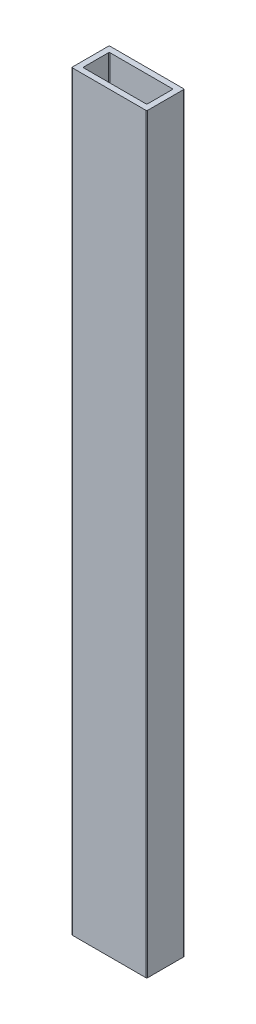
ISO-10303-21;
HEADER;
FILE_DESCRIPTION(('STEP AP214'),'2;1');
FILE_NAME('part.step','',(''),(''),'','','');
FILE_SCHEMA(('AUTOMOTIVE_DESIGN { 1 0 10303 214 1 1 1 1 }'));
ENDSEC;
DATA;
#1=APPLICATION_CONTEXT('core data for automotive mechanical design processes');
#2=APPLICATION_PROTOCOL_DEFINITION('international standard','automotive_design',2000,#1);
#3=PRODUCT_CONTEXT('',#1,'mechanical');
#4=PRODUCT('Part','Part','',(#3));
#5=PRODUCT_RELATED_PRODUCT_CATEGORY('part','',(#4));
#6=PRODUCT_DEFINITION_FORMATION('','',#4);
#7=PRODUCT_DEFINITION_CONTEXT('part definition',#1,'design');
#8=PRODUCT_DEFINITION('design','',#6,#7);
#9=PRODUCT_DEFINITION_SHAPE('','',#8);
#10=(LENGTH_UNIT() NAMED_UNIT(*) SI_UNIT(.MILLI.,.METRE.));
#11=(NAMED_UNIT(*) PLANE_ANGLE_UNIT() SI_UNIT($,.RADIAN.));
#12=(NAMED_UNIT(*) SI_UNIT($,.STERADIAN.) SOLID_ANGLE_UNIT());
#13=UNCERTAINTY_MEASURE_WITH_UNIT(LENGTH_MEASURE(1.E-05),#10,'distance_accuracy_value','');
#14=(GEOMETRIC_REPRESENTATION_CONTEXT(3) GLOBAL_UNCERTAINTY_ASSIGNED_CONTEXT((#13)) GLOBAL_UNIT_ASSIGNED_CONTEXT((#10,
#11,#12)) REPRESENTATION_CONTEXT('',''));
#15=CARTESIAN_POINT('',(0.,0.,0.));
#16=DIRECTION('',(0.,0.,1.));
#17=DIRECTION('',(1.,0.,0.));
#18=AXIS2_PLACEMENT_3D('',#15,#16,#17);
#19=CARTESIAN_POINT('',(0.,200.,0.));
#20=DIRECTION('',(0.,-1.,0.));
#21=DIRECTION('',(0.,0.,-1.));
#22=AXIS2_PLACEMENT_3D('',#19,#20,#21);
#23=PLANE('',#22);
#24=DIRECTION('',(0.,0.,-1.));
#25=VECTOR('',#24,1.);
#26=CARTESIAN_POINT('',(10.,200.,-5.));
#27=LINE('',#26,#25);
#28=CARTESIAN_POINT('',(10.,200.,4.8));
#29=VERTEX_POINT('',#28);
#30=CARTESIAN_POINT('',(10.,200.,-4.8));
#31=VERTEX_POINT('',#30);
#32=EDGE_CURVE('E278',#29,#31,#27,.T.);
#33=ORIENTED_EDGE('',*,*,#32,.T.);
#34=CARTESIAN_POINT('',(9.8,200.,-4.8));
#35=DIRECTION('',(0.,-1.,0.));
#36=DIRECTION('',(0.,0.,-1.));
#37=AXIS2_PLACEMENT_3D('',#34,#35,#36);
#38=CIRCLE('',#37,0.2);
#39=CARTESIAN_POINT('',(9.8,200.,-5.));
#40=VERTEX_POINT('',#39);
#41=EDGE_CURVE('E199',#31,#40,#38,.F.);
#42=ORIENTED_EDGE('',*,*,#41,.T.);
#43=DIRECTION('',(-1.,0.,0.));
#44=VECTOR('',#43,1.);
#45=CARTESIAN_POINT('',(10.,200.,-5.));
#46=LINE('',#45,#44);
#47=CARTESIAN_POINT('',(-9.8,200.,-5.));
#48=VERTEX_POINT('',#47);
#49=EDGE_CURVE('E168',#40,#48,#46,.T.);
#50=ORIENTED_EDGE('',*,*,#49,.T.);
#51=CARTESIAN_POINT('',(-9.8,200.,-4.8));
#52=DIRECTION('',(0.,-1.,0.));
#53=DIRECTION('',(0.,0.,-1.));
#54=AXIS2_PLACEMENT_3D('',#51,#52,#53);
#55=CIRCLE('',#54,0.2);
#56=CARTESIAN_POINT('',(-10.,200.,-4.8));
#57=VERTEX_POINT('',#56);
#58=EDGE_CURVE('E197',#48,#57,#55,.F.);
#59=ORIENTED_EDGE('',*,*,#58,.T.);
#60=DIRECTION('',(0.,0.,1.));
#61=VECTOR('',#60,1.);
#62=CARTESIAN_POINT('',(-10.,200.,-5.));
#63=LINE('',#62,#61);
#64=CARTESIAN_POINT('',(-10.,200.,4.8));
#65=VERTEX_POINT('',#64);
#66=EDGE_CURVE('E175',#57,#65,#63,.T.);
#67=ORIENTED_EDGE('',*,*,#66,.T.);
#68=CARTESIAN_POINT('',(-9.8,200.,4.8));
#69=DIRECTION('',(0.,-1.,0.));
#70=DIRECTION('',(0.,0.,-1.));
#71=AXIS2_PLACEMENT_3D('',#68,#69,#70);
#72=CIRCLE('',#71,0.2);
#73=CARTESIAN_POINT('',(-9.8,200.,5.));
#74=VERTEX_POINT('',#73);
#75=EDGE_CURVE('E193',#65,#74,#72,.F.);
#76=ORIENTED_EDGE('',*,*,#75,.T.);
#77=DIRECTION('',(1.,0.,0.));
#78=VECTOR('',#77,1.);
#79=CARTESIAN_POINT('',(10.,200.,5.));
#80=LINE('',#79,#78);
#81=CARTESIAN_POINT('',(9.8,200.,5.));
#82=VERTEX_POINT('',#81);
#83=EDGE_CURVE('E179',#74,#82,#80,.T.);
#84=ORIENTED_EDGE('',*,*,#83,.T.);
#85=CARTESIAN_POINT('',(9.8,200.,4.8));
#86=DIRECTION('',(0.,-1.,0.));
#87=DIRECTION('',(0.,0.,-1.));
#88=AXIS2_PLACEMENT_3D('',#85,#86,#87);
#89=CIRCLE('',#88,0.2);
#90=EDGE_CURVE('E195',#82,#29,#89,.F.);
#91=ORIENTED_EDGE('',*,*,#90,.T.);
#92=EDGE_LOOP('',(#33,#42,#50,#59,#67,#76,#84,#91));
#93=FACE_BOUND('',#92,.T.);
#94=DIRECTION('',(0.,0.,-1.));
#95=VECTOR('',#94,1.);
#96=CARTESIAN_POINT('',(8.5,200.,-3.5));
#97=LINE('',#96,#95);
#98=CARTESIAN_POINT('',(8.5,200.,3.3));
#99=VERTEX_POINT('',#98);
#100=CARTESIAN_POINT('',(8.5,200.,-3.3));
#101=VERTEX_POINT('',#100);
#102=EDGE_CURVE('E260',#99,#101,#97,.T.);
#103=ORIENTED_EDGE('',*,*,#102,.F.);
#104=CARTESIAN_POINT('',(8.3,200.,3.3));
#105=DIRECTION('',(0.,-1.,0.));
#106=DIRECTION('',(0.,0.,-1.));
#107=AXIS2_PLACEMENT_3D('',#104,#105,#106);
#108=CIRCLE('',#107,0.2);
#109=CARTESIAN_POINT('',(8.3,200.,3.5));
#110=VERTEX_POINT('',#109);
#111=EDGE_CURVE('E236',#99,#110,#108,.T.);
#112=ORIENTED_EDGE('',*,*,#111,.T.);
#113=DIRECTION('',(1.,0.,0.));
#114=VECTOR('',#113,1.);
#115=CARTESIAN_POINT('',(8.5,200.,3.5));
#116=LINE('',#115,#114);
#117=CARTESIAN_POINT('',(-8.3,200.,3.5));
#118=VERTEX_POINT('',#117);
#119=EDGE_CURVE('E262',#118,#110,#116,.T.);
#120=ORIENTED_EDGE('',*,*,#119,.F.);
#121=CARTESIAN_POINT('',(-8.3,200.,3.3));
#122=DIRECTION('',(0.,-1.,0.));
#123=DIRECTION('',(0.,0.,-1.));
#124=AXIS2_PLACEMENT_3D('',#121,#122,#123);
#125=CIRCLE('',#124,0.2);
#126=CARTESIAN_POINT('',(-8.5,200.,3.3));
#127=VERTEX_POINT('',#126);
#128=EDGE_CURVE('E240',#118,#127,#125,.T.);
#129=ORIENTED_EDGE('',*,*,#128,.T.);
#130=DIRECTION('',(0.,0.,1.));
#131=VECTOR('',#130,1.);
#132=CARTESIAN_POINT('',(-8.5,200.,-3.5));
#133=LINE('',#132,#131);
#134=CARTESIAN_POINT('',(-8.5,200.,-3.3));
#135=VERTEX_POINT('',#134);
#136=EDGE_CURVE('E259',#135,#127,#133,.T.);
#137=ORIENTED_EDGE('',*,*,#136,.F.);
#138=CARTESIAN_POINT('',(-8.3,200.,-3.3));
#139=DIRECTION('',(0.,-1.,0.));
#140=DIRECTION('',(0.,0.,-1.));
#141=AXIS2_PLACEMENT_3D('',#138,#139,#140);
#142=CIRCLE('',#141,0.2);
#143=CARTESIAN_POINT('',(-8.3,200.,-3.5));
#144=VERTEX_POINT('',#143);
#145=EDGE_CURVE('E11',#135,#144,#142,.T.);
#146=ORIENTED_EDGE('',*,*,#145,.T.);
#147=DIRECTION('',(-1.,0.,0.));
#148=VECTOR('',#147,1.);
#149=CARTESIAN_POINT('',(8.5,200.,-3.5));
#150=LINE('',#149,#148);
#151=CARTESIAN_POINT('',(8.3,200.,-3.5));
#152=VERTEX_POINT('',#151);
#153=EDGE_CURVE('E257',#152,#144,#150,.T.);
#154=ORIENTED_EDGE('',*,*,#153,.F.);
#155=CARTESIAN_POINT('',(8.3,200.,-3.3));
#156=DIRECTION('',(0.,-1.,0.));
#157=DIRECTION('',(0.,0.,-1.));
#158=AXIS2_PLACEMENT_3D('',#155,#156,#157);
#159=CIRCLE('',#158,0.2);
#160=EDGE_CURVE('E232',#152,#101,#159,.T.);
#161=ORIENTED_EDGE('',*,*,#160,.T.);
#162=EDGE_LOOP('',(#103,#112,#120,#129,#137,#146,#154,#161));
#163=FACE_BOUND('',#162,.T.);
#164=ADVANCED_FACE('F35',(#93,#163),#23,.F.);
#165=CARTESIAN_POINT('',(0.,0.,0.));
#166=DIRECTION('',(0.,-1.,0.));
#167=DIRECTION('',(0.,0.,-1.));
#168=AXIS2_PLACEMENT_3D('',#165,#166,#167);
#169=PLANE('',#168);
#170=DIRECTION('',(-1.,0.,0.));
#171=VECTOR('',#170,1.);
#172=CARTESIAN_POINT('',(10.,0.,-5.));
#173=LINE('',#172,#171);
#174=CARTESIAN_POINT('',(9.8,0.,-5.));
#175=VERTEX_POINT('',#174);
#176=CARTESIAN_POINT('',(-9.8,0.,-5.));
#177=VERTEX_POINT('',#176);
#178=EDGE_CURVE('E165',#175,#177,#173,.T.);
#179=ORIENTED_EDGE('',*,*,#178,.F.);
#180=CARTESIAN_POINT('',(9.8,0.,-4.8));
#181=DIRECTION('',(0.,-1.,0.));
#182=DIRECTION('',(0.,0.,-1.));
#183=AXIS2_PLACEMENT_3D('',#180,#181,#182);
#184=CIRCLE('',#183,0.2);
#185=CARTESIAN_POINT('',(10.,0.,-4.8));
#186=VERTEX_POINT('',#185);
#187=EDGE_CURVE('E148',#175,#186,#184,.T.);
#188=ORIENTED_EDGE('',*,*,#187,.T.);
#189=DIRECTION('',(0.,0.,-1.));
#190=VECTOR('',#189,1.);
#191=CARTESIAN_POINT('',(10.,0.,-5.));
#192=LINE('',#191,#190);
#193=CARTESIAN_POINT('',(10.,0.,4.8));
#194=VERTEX_POINT('',#193);
#195=EDGE_CURVE('E176',#194,#186,#192,.T.);
#196=ORIENTED_EDGE('',*,*,#195,.F.);
#197=CARTESIAN_POINT('',(9.8,0.,4.8));
#198=DIRECTION('',(0.,-1.,0.));
#199=DIRECTION('',(0.,0.,-1.));
#200=AXIS2_PLACEMENT_3D('',#197,#198,#199);
#201=CIRCLE('',#200,0.2);
#202=CARTESIAN_POINT('',(9.8,0.,5.));
#203=VERTEX_POINT('',#202);
#204=EDGE_CURVE('E187',#194,#203,#201,.T.);
#205=ORIENTED_EDGE('',*,*,#204,.T.);
#206=DIRECTION('',(1.,0.,0.));
#207=VECTOR('',#206,1.);
#208=CARTESIAN_POINT('',(10.,0.,5.));
#209=LINE('',#208,#207);
#210=CARTESIAN_POINT('',(-9.8,0.,5.));
#211=VERTEX_POINT('',#210);
#212=EDGE_CURVE('E181',#211,#203,#209,.T.);
#213=ORIENTED_EDGE('',*,*,#212,.F.);
#214=CARTESIAN_POINT('',(-9.8,0.,4.8));
#215=DIRECTION('',(0.,-1.,0.));
#216=DIRECTION('',(0.,0.,-1.));
#217=AXIS2_PLACEMENT_3D('',#214,#215,#216);
#218=CIRCLE('',#217,0.2);
#219=CARTESIAN_POINT('',(-10.,0.,4.8));
#220=VERTEX_POINT('',#219);
#221=EDGE_CURVE('E169',#211,#220,#218,.T.);
#222=ORIENTED_EDGE('',*,*,#221,.T.);
#223=DIRECTION('',(0.,0.,1.));
#224=VECTOR('',#223,1.);
#225=CARTESIAN_POINT('',(-10.,0.,-5.));
#226=LINE('',#225,#224);
#227=CARTESIAN_POINT('',(-10.,0.,-4.8));
#228=VERTEX_POINT('',#227);
#229=EDGE_CURVE('E269',#228,#220,#226,.T.);
#230=ORIENTED_EDGE('',*,*,#229,.F.);
#231=CARTESIAN_POINT('',(-9.8,0.,-4.8));
#232=DIRECTION('',(0.,-1.,0.));
#233=DIRECTION('',(0.,0.,-1.));
#234=AXIS2_PLACEMENT_3D('',#231,#232,#233);
#235=CIRCLE('',#234,0.2);
#236=EDGE_CURVE('E159',#228,#177,#235,.T.);
#237=ORIENTED_EDGE('',*,*,#236,.T.);
#238=EDGE_LOOP('',(#179,#188,#196,#205,#213,#222,#230,#237));
#239=FACE_BOUND('',#238,.T.);
#240=DIRECTION('',(0.,0.,1.));
#241=VECTOR('',#240,1.);
#242=CARTESIAN_POINT('',(-8.5,0.,-3.5));
#243=LINE('',#242,#241);
#244=CARTESIAN_POINT('',(-8.5,0.,-3.3));
#245=VERTEX_POINT('',#244);
#246=CARTESIAN_POINT('',(-8.5,0.,3.3));
#247=VERTEX_POINT('',#246);
#248=EDGE_CURVE('E244',#245,#247,#243,.T.);
#249=ORIENTED_EDGE('',*,*,#248,.T.);
#250=CARTESIAN_POINT('',(-8.3,0.,3.3));
#251=DIRECTION('',(0.,-1.,0.));
#252=DIRECTION('',(0.,0.,-1.));
#253=AXIS2_PLACEMENT_3D('',#250,#251,#252);
#254=CIRCLE('',#253,0.2);
#255=CARTESIAN_POINT('',(-8.3,0.,3.5));
#256=VERTEX_POINT('',#255);
#257=EDGE_CURVE('E238',#247,#256,#254,.F.);
#258=ORIENTED_EDGE('',*,*,#257,.T.);
#259=DIRECTION('',(1.,0.,0.));
#260=VECTOR('',#259,1.);
#261=CARTESIAN_POINT('',(8.5,0.,3.5));
#262=LINE('',#261,#260);
#263=CARTESIAN_POINT('',(8.3,0.,3.5));
#264=VERTEX_POINT('',#263);
#265=EDGE_CURVE('E253',#256,#264,#262,.T.);
#266=ORIENTED_EDGE('',*,*,#265,.T.);
#267=CARTESIAN_POINT('',(8.3,0.,3.3));
#268=DIRECTION('',(0.,-1.,0.));
#269=DIRECTION('',(0.,0.,-1.));
#270=AXIS2_PLACEMENT_3D('',#267,#268,#269);
#271=CIRCLE('',#270,0.2);
#272=CARTESIAN_POINT('',(8.5,0.,3.3));
#273=VERTEX_POINT('',#272);
#274=EDGE_CURVE('E234',#264,#273,#271,.F.);
#275=ORIENTED_EDGE('',*,*,#274,.T.);
#276=DIRECTION('',(0.,0.,-1.));
#277=VECTOR('',#276,1.);
#278=CARTESIAN_POINT('',(8.5,0.,-3.5));
#279=LINE('',#278,#277);
#280=CARTESIAN_POINT('',(8.5,0.,-3.3));
#281=VERTEX_POINT('',#280);
#282=EDGE_CURVE('E270',#273,#281,#279,.T.);
#283=ORIENTED_EDGE('',*,*,#282,.T.);
#284=CARTESIAN_POINT('',(8.3,0.,-3.3));
#285=DIRECTION('',(0.,-1.,0.));
#286=DIRECTION('',(0.,0.,-1.));
#287=AXIS2_PLACEMENT_3D('',#284,#285,#286);
#288=CIRCLE('',#287,0.2);
#289=CARTESIAN_POINT('',(8.3,0.,-3.5));
#290=VERTEX_POINT('',#289);
#291=EDGE_CURVE('E230',#281,#290,#288,.F.);
#292=ORIENTED_EDGE('',*,*,#291,.T.);
#293=DIRECTION('',(-1.,0.,0.));
#294=VECTOR('',#293,1.);
#295=CARTESIAN_POINT('',(8.5,0.,-3.5));
#296=LINE('',#295,#294);
#297=CARTESIAN_POINT('',(-8.3,0.,-3.5));
#298=VERTEX_POINT('',#297);
#299=EDGE_CURVE('E245',#290,#298,#296,.T.);
#300=ORIENTED_EDGE('',*,*,#299,.T.);
#301=CARTESIAN_POINT('',(-8.3,0.,-3.3));
#302=DIRECTION('',(0.,-1.,0.));
#303=DIRECTION('',(0.,0.,-1.));
#304=AXIS2_PLACEMENT_3D('',#301,#302,#303);
#305=CIRCLE('',#304,0.2);
#306=EDGE_CURVE('E43',#298,#245,#305,.F.);
#307=ORIENTED_EDGE('',*,*,#306,.T.);
#308=EDGE_LOOP('',(#249,#258,#266,#275,#283,#292,#300,#307));
#309=FACE_BOUND('',#308,.T.);
#310=ADVANCED_FACE('F172',(#239,#309),#169,.T.);
#311=CARTESIAN_POINT('',(-10.,200.,-5.));
#312=DIRECTION('',(1.,0.,0.));
#313=DIRECTION('',(0.,0.,-1.));
#314=AXIS2_PLACEMENT_3D('',#311,#312,#313);
#315=PLANE('',#314);
#316=ORIENTED_EDGE('',*,*,#66,.F.);
#317=DIRECTION('',(0.,-1.,0.));
#318=VECTOR('',#317,1.);
#319=CARTESIAN_POINT('',(-10.,200.,-4.8));
#320=LINE('',#319,#318);
#321=EDGE_CURVE('E222',#57,#228,#320,.T.);
#322=ORIENTED_EDGE('',*,*,#321,.T.);
#323=ORIENTED_EDGE('',*,*,#229,.T.);
#324=DIRECTION('',(0.,-1.,0.));
#325=VECTOR('',#324,1.);
#326=CARTESIAN_POINT('',(-10.,200.,4.8));
#327=LINE('',#326,#325);
#328=EDGE_CURVE('E220',#220,#65,#327,.F.);
#329=ORIENTED_EDGE('',*,*,#328,.T.);
#330=EDGE_LOOP('',(#316,#322,#323,#329));
#331=FACE_BOUND('',#330,.T.);
#332=ADVANCED_FACE('F306',(#331),#315,.F.);
#333=CARTESIAN_POINT('',(10.,200.,5.));
#334=DIRECTION('',(0.,0.,-1.));
#335=DIRECTION('',(-1.,0.,0.));
#336=AXIS2_PLACEMENT_3D('',#333,#334,#335);
#337=PLANE('',#336);
#338=ORIENTED_EDGE('',*,*,#212,.T.);
#339=DIRECTION('',(0.,-1.,0.));
#340=VECTOR('',#339,1.);
#341=CARTESIAN_POINT('',(9.8,200.,5.));
#342=LINE('',#341,#340);
#343=EDGE_CURVE('E228',#203,#82,#342,.F.);
#344=ORIENTED_EDGE('',*,*,#343,.T.);
#345=ORIENTED_EDGE('',*,*,#83,.F.);
#346=DIRECTION('',(0.,-1.,0.));
#347=VECTOR('',#346,1.);
#348=CARTESIAN_POINT('',(-9.8,200.,5.));
#349=LINE('',#348,#347);
#350=EDGE_CURVE('E225',#74,#211,#349,.T.);
#351=ORIENTED_EDGE('',*,*,#350,.T.);
#352=EDGE_LOOP('',(#338,#344,#345,#351));
#353=FACE_BOUND('',#352,.T.);
#354=ADVANCED_FACE('F287',(#353),#337,.F.);
#355=CARTESIAN_POINT('',(10.,200.,-5.));
#356=DIRECTION('',(-1.,0.,0.));
#357=DIRECTION('',(0.,0.,1.));
#358=AXIS2_PLACEMENT_3D('',#355,#356,#357);
#359=PLANE('',#358);
#360=ORIENTED_EDGE('',*,*,#195,.T.);
#361=DIRECTION('',(0.,-1.,0.));
#362=VECTOR('',#361,1.);
#363=CARTESIAN_POINT('',(10.,200.,-4.8));
#364=LINE('',#363,#362);
#365=EDGE_CURVE('E153',#186,#31,#364,.F.);
#366=ORIENTED_EDGE('',*,*,#365,.T.);
#367=ORIENTED_EDGE('',*,*,#32,.F.);
#368=DIRECTION('',(0.,-1.,0.));
#369=VECTOR('',#368,1.);
#370=CARTESIAN_POINT('',(10.,200.,4.8));
#371=LINE('',#370,#369);
#372=EDGE_CURVE('E158',#29,#194,#371,.T.);
#373=ORIENTED_EDGE('',*,*,#372,.T.);
#374=EDGE_LOOP('',(#360,#366,#367,#373));
#375=FACE_BOUND('',#374,.T.);
#376=ADVANCED_FACE('F297',(#375),#359,.F.);
#377=CARTESIAN_POINT('',(10.,200.,-5.));
#378=DIRECTION('',(0.,0.,1.));
#379=DIRECTION('',(1.,0.,0.));
#380=AXIS2_PLACEMENT_3D('',#377,#378,#379);
#381=PLANE('',#380);
#382=ORIENTED_EDGE('',*,*,#49,.F.);
#383=DIRECTION('',(0.,-1.,0.));
#384=VECTOR('',#383,1.);
#385=CARTESIAN_POINT('',(9.8,200.,-5.));
#386=LINE('',#385,#384);
#387=EDGE_CURVE('E152',#40,#175,#386,.T.);
#388=ORIENTED_EDGE('',*,*,#387,.T.);
#389=ORIENTED_EDGE('',*,*,#178,.T.);
#390=DIRECTION('',(0.,-1.,0.));
#391=VECTOR('',#390,1.);
#392=CARTESIAN_POINT('',(-9.8,200.,-5.));
#393=LINE('',#392,#391);
#394=EDGE_CURVE('E170',#177,#48,#393,.F.);
#395=ORIENTED_EDGE('',*,*,#394,.T.);
#396=EDGE_LOOP('',(#382,#388,#389,#395));
#397=FACE_BOUND('',#396,.T.);
#398=ADVANCED_FACE('F164',(#397),#381,.F.);
#399=CARTESIAN_POINT('',(8.5,200.,-3.5));
#400=DIRECTION('',(-1.,0.,0.));
#401=DIRECTION('',(0.,0.,1.));
#402=AXIS2_PLACEMENT_3D('',#399,#400,#401);
#403=PLANE('',#402);
#404=ORIENTED_EDGE('',*,*,#102,.T.);
#405=DIRECTION('',(0.,-1.,0.));
#406=VECTOR('',#405,1.);
#407=CARTESIAN_POINT('',(8.5,0.,-3.3));
#408=LINE('',#407,#406);
#409=EDGE_CURVE('E203',#101,#281,#408,.T.);
#410=ORIENTED_EDGE('',*,*,#409,.T.);
#411=ORIENTED_EDGE('',*,*,#282,.F.);
#412=DIRECTION('',(0.,-1.,0.));
#413=VECTOR('',#412,1.);
#414=CARTESIAN_POINT('',(8.5,200.,3.3));
#415=LINE('',#414,#413);
#416=EDGE_CURVE('E201',#273,#99,#415,.F.);
#417=ORIENTED_EDGE('',*,*,#416,.T.);
#418=EDGE_LOOP('',(#404,#410,#411,#417));
#419=FACE_BOUND('',#418,.T.);
#420=ADVANCED_FACE('F304',(#419),#403,.T.);
#421=CARTESIAN_POINT('',(8.5,200.,-3.5));
#422=DIRECTION('',(0.,0.,1.));
#423=DIRECTION('',(1.,0.,0.));
#424=AXIS2_PLACEMENT_3D('',#421,#422,#423);
#425=PLANE('',#424);
#426=ORIENTED_EDGE('',*,*,#299,.F.);
#427=DIRECTION('',(0.,-1.,0.));
#428=VECTOR('',#427,1.);
#429=CARTESIAN_POINT('',(8.3,200.,-3.5));
#430=LINE('',#429,#428);
#431=EDGE_CURVE('E55',#290,#152,#430,.F.);
#432=ORIENTED_EDGE('',*,*,#431,.T.);
#433=ORIENTED_EDGE('',*,*,#153,.T.);
#434=DIRECTION('',(0.,-1.,0.));
#435=VECTOR('',#434,1.);
#436=CARTESIAN_POINT('',(-8.3,0.,-3.5));
#437=LINE('',#436,#435);
#438=EDGE_CURVE('E206',#144,#298,#437,.T.);
#439=ORIENTED_EDGE('',*,*,#438,.T.);
#440=EDGE_LOOP('',(#426,#432,#433,#439));
#441=FACE_BOUND('',#440,.T.);
#442=ADVANCED_FACE('F256',(#441),#425,.T.);
#443=CARTESIAN_POINT('',(-8.5,200.,-3.5));
#444=DIRECTION('',(1.,0.,0.));
#445=DIRECTION('',(0.,0.,-1.));
#446=AXIS2_PLACEMENT_3D('',#443,#444,#445);
#447=PLANE('',#446);
#448=ORIENTED_EDGE('',*,*,#136,.T.);
#449=DIRECTION('',(0.,-1.,0.));
#450=VECTOR('',#449,1.);
#451=CARTESIAN_POINT('',(-8.5,0.,3.3));
#452=LINE('',#451,#450);
#453=EDGE_CURVE('E217',#127,#247,#452,.T.);
#454=ORIENTED_EDGE('',*,*,#453,.T.);
#455=ORIENTED_EDGE('',*,*,#248,.F.);
#456=DIRECTION('',(0.,-1.,0.));
#457=VECTOR('',#456,1.);
#458=CARTESIAN_POINT('',(-8.5,200.,-3.3));
#459=LINE('',#458,#457);
#460=EDGE_CURVE('E215',#245,#135,#459,.F.);
#461=ORIENTED_EDGE('',*,*,#460,.T.);
#462=EDGE_LOOP('',(#448,#454,#455,#461));
#463=FACE_BOUND('',#462,.T.);
#464=ADVANCED_FACE('F251',(#463),#447,.T.);
#465=CARTESIAN_POINT('',(8.5,200.,3.5));
#466=DIRECTION('',(0.,0.,-1.));
#467=DIRECTION('',(-1.,0.,0.));
#468=AXIS2_PLACEMENT_3D('',#465,#466,#467);
#469=PLANE('',#468);
#470=ORIENTED_EDGE('',*,*,#119,.T.);
#471=DIRECTION('',(0.,-1.,0.));
#472=VECTOR('',#471,1.);
#473=CARTESIAN_POINT('',(8.3,0.,3.5));
#474=LINE('',#473,#472);
#475=EDGE_CURVE('E212',#110,#264,#474,.T.);
#476=ORIENTED_EDGE('',*,*,#475,.T.);
#477=ORIENTED_EDGE('',*,*,#265,.F.);
#478=DIRECTION('',(0.,-1.,0.));
#479=VECTOR('',#478,1.);
#480=CARTESIAN_POINT('',(-8.3,200.,3.5));
#481=LINE('',#480,#479);
#482=EDGE_CURVE('E210',#256,#118,#481,.F.);
#483=ORIENTED_EDGE('',*,*,#482,.T.);
#484=EDGE_LOOP('',(#470,#476,#477,#483));
#485=FACE_BOUND('',#484,.T.);
#486=ADVANCED_FACE('F322',(#485),#469,.T.);
#487=CARTESIAN_POINT('',(9.8,200.,-4.8));
#488=DIRECTION('',(0.,-1.,0.));
#489=DIRECTION('',(0.,0.,-1.));
#490=AXIS2_PLACEMENT_3D('',#487,#488,#489);
#491=CYLINDRICAL_SURFACE('',#490,0.2);
#492=ORIENTED_EDGE('',*,*,#41,.F.);
#493=ORIENTED_EDGE('',*,*,#365,.F.);
#494=ORIENTED_EDGE('',*,*,#187,.F.);
#495=ORIENTED_EDGE('',*,*,#387,.F.);
#496=EDGE_LOOP('',(#492,#493,#494,#495));
#497=FACE_BOUND('',#496,.T.);
#498=ADVANCED_FACE('F151',(#497),#491,.T.);
#499=CARTESIAN_POINT('',(8.3,200.,-3.3));
#500=DIRECTION('',(0.,1.,0.));
#501=DIRECTION('',(0.,0.,1.));
#502=AXIS2_PLACEMENT_3D('',#499,#500,#501);
#503=CYLINDRICAL_SURFACE('',#502,0.2);
#504=ORIENTED_EDGE('',*,*,#160,.F.);
#505=ORIENTED_EDGE('',*,*,#431,.F.);
#506=ORIENTED_EDGE('',*,*,#291,.F.);
#507=ORIENTED_EDGE('',*,*,#409,.F.);
#508=EDGE_LOOP('',(#504,#505,#506,#507));
#509=FACE_BOUND('',#508,.T.);
#510=ADVANCED_FACE('F328',(#509),#503,.F.);
#511=CARTESIAN_POINT('',(8.3,200.,3.3));
#512=DIRECTION('',(0.,1.,0.));
#513=DIRECTION('',(0.,0.,1.));
#514=AXIS2_PLACEMENT_3D('',#511,#512,#513);
#515=CYLINDRICAL_SURFACE('',#514,0.2);
#516=ORIENTED_EDGE('',*,*,#111,.F.);
#517=ORIENTED_EDGE('',*,*,#416,.F.);
#518=ORIENTED_EDGE('',*,*,#274,.F.);
#519=ORIENTED_EDGE('',*,*,#475,.F.);
#520=EDGE_LOOP('',(#516,#517,#518,#519));
#521=FACE_BOUND('',#520,.T.);
#522=ADVANCED_FACE('F337',(#521),#515,.F.);
#523=CARTESIAN_POINT('',(-8.3,200.,3.3));
#524=DIRECTION('',(0.,1.,0.));
#525=DIRECTION('',(0.,0.,1.));
#526=AXIS2_PLACEMENT_3D('',#523,#524,#525);
#527=CYLINDRICAL_SURFACE('',#526,0.2);
#528=ORIENTED_EDGE('',*,*,#128,.F.);
#529=ORIENTED_EDGE('',*,*,#482,.F.);
#530=ORIENTED_EDGE('',*,*,#257,.F.);
#531=ORIENTED_EDGE('',*,*,#453,.F.);
#532=EDGE_LOOP('',(#528,#529,#530,#531));
#533=FACE_BOUND('',#532,.T.);
#534=ADVANCED_FACE('F348',(#533),#527,.F.);
#535=CARTESIAN_POINT('',(-8.3,200.,-3.3));
#536=DIRECTION('',(0.,1.,0.));
#537=DIRECTION('',(0.,0.,1.));
#538=AXIS2_PLACEMENT_3D('',#535,#536,#537);
#539=CYLINDRICAL_SURFACE('',#538,0.2);
#540=ORIENTED_EDGE('',*,*,#145,.F.);
#541=ORIENTED_EDGE('',*,*,#460,.F.);
#542=ORIENTED_EDGE('',*,*,#306,.F.);
#543=ORIENTED_EDGE('',*,*,#438,.F.);
#544=EDGE_LOOP('',(#540,#541,#542,#543));
#545=FACE_BOUND('',#544,.T.);
#546=ADVANCED_FACE('F255',(#545),#539,.F.);
#547=CARTESIAN_POINT('',(-9.8,200.,-4.8));
#548=DIRECTION('',(0.,-1.,0.));
#549=DIRECTION('',(0.,0.,-1.));
#550=AXIS2_PLACEMENT_3D('',#547,#548,#549);
#551=CYLINDRICAL_SURFACE('',#550,0.2);
#552=ORIENTED_EDGE('',*,*,#58,.F.);
#553=ORIENTED_EDGE('',*,*,#394,.F.);
#554=ORIENTED_EDGE('',*,*,#236,.F.);
#555=ORIENTED_EDGE('',*,*,#321,.F.);
#556=EDGE_LOOP('',(#552,#553,#554,#555));
#557=FACE_BOUND('',#556,.T.);
#558=ADVANCED_FACE('F357',(#557),#551,.T.);
#559=CARTESIAN_POINT('',(9.8,200.,4.8));
#560=DIRECTION('',(0.,-1.,0.));
#561=DIRECTION('',(0.,0.,-1.));
#562=AXIS2_PLACEMENT_3D('',#559,#560,#561);
#563=CYLINDRICAL_SURFACE('',#562,0.2);
#564=ORIENTED_EDGE('',*,*,#90,.F.);
#565=ORIENTED_EDGE('',*,*,#343,.F.);
#566=ORIENTED_EDGE('',*,*,#204,.F.);
#567=ORIENTED_EDGE('',*,*,#372,.F.);
#568=EDGE_LOOP('',(#564,#565,#566,#567));
#569=FACE_BOUND('',#568,.T.);
#570=ADVANCED_FACE('F292',(#569),#563,.T.);
#571=CARTESIAN_POINT('',(-9.8,200.,4.8));
#572=DIRECTION('',(0.,-1.,0.));
#573=DIRECTION('',(0.,0.,-1.));
#574=AXIS2_PLACEMENT_3D('',#571,#572,#573);
#575=CYLINDRICAL_SURFACE('',#574,0.2);
#576=ORIENTED_EDGE('',*,*,#75,.F.);
#577=ORIENTED_EDGE('',*,*,#328,.F.);
#578=ORIENTED_EDGE('',*,*,#221,.F.);
#579=ORIENTED_EDGE('',*,*,#350,.F.);
#580=EDGE_LOOP('',(#576,#577,#578,#579));
#581=FACE_BOUND('',#580,.T.);
#582=ADVANCED_FACE('F37',(#581),#575,.T.);
#583=CLOSED_SHELL('',(#164,#310,#332,#354,#376,#398,#420,#442,#464,#486,#498,#510,#522,#534,
#546,#558,#570,#582));
#584=MANIFOLD_SOLID_BREP('B2',#583);
#585=ADVANCED_BREP_SHAPE_REPRESENTATION('',(#18,#584),#14);
#586=SHAPE_DEFINITION_REPRESENTATION(#9,#585);
ENDSEC;
END-ISO-10303-21;
